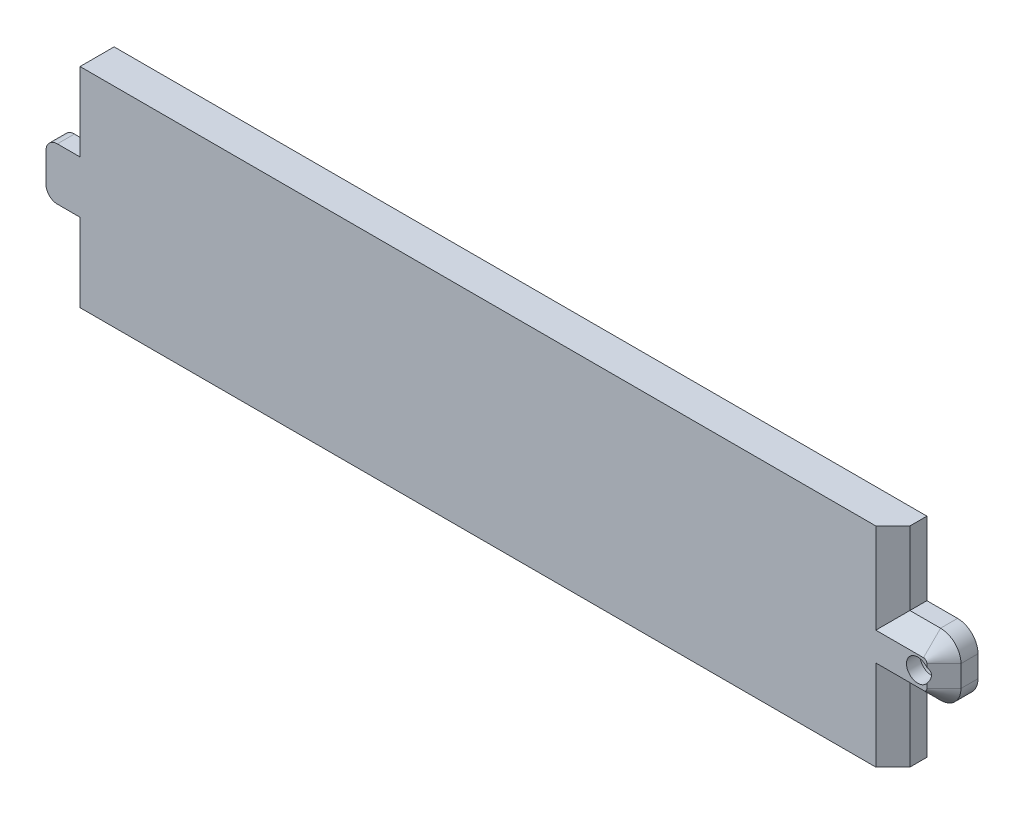
ISO-10303-21;
HEADER;
FILE_DESCRIPTION(('STEP AP214'),'2;1');
FILE_NAME('part.step','',(''),(''),'','','');
FILE_SCHEMA(('AUTOMOTIVE_DESIGN { 1 0 10303 214 1 1 1 1 }'));
ENDSEC;
DATA;
#1=APPLICATION_CONTEXT('core data for automotive mechanical design processes');
#2=APPLICATION_PROTOCOL_DEFINITION('international standard','automotive_design',2000,#1);
#3=PRODUCT_CONTEXT('',#1,'mechanical');
#4=PRODUCT('Part','Part','',(#3));
#5=PRODUCT_RELATED_PRODUCT_CATEGORY('part','',(#4));
#6=PRODUCT_DEFINITION_FORMATION('','',#4);
#7=PRODUCT_DEFINITION_CONTEXT('part definition',#1,'design');
#8=PRODUCT_DEFINITION('design','',#6,#7);
#9=PRODUCT_DEFINITION_SHAPE('','',#8);
#10=(LENGTH_UNIT() NAMED_UNIT(*) SI_UNIT(.MILLI.,.METRE.));
#11=(NAMED_UNIT(*) PLANE_ANGLE_UNIT() SI_UNIT($,.RADIAN.));
#12=(NAMED_UNIT(*) SI_UNIT($,.STERADIAN.) SOLID_ANGLE_UNIT());
#13=UNCERTAINTY_MEASURE_WITH_UNIT(LENGTH_MEASURE(1.E-05),#10,'distance_accuracy_value','');
#14=(GEOMETRIC_REPRESENTATION_CONTEXT(3) GLOBAL_UNCERTAINTY_ASSIGNED_CONTEXT((#13)) GLOBAL_UNIT_ASSIGNED_CONTEXT((#10,
#11,#12)) REPRESENTATION_CONTEXT('',''));
#15=CARTESIAN_POINT('',(0.,0.,0.));
#16=DIRECTION('',(0.,0.,1.));
#17=DIRECTION('',(1.,0.,0.));
#18=AXIS2_PLACEMENT_3D('',#15,#16,#17);
#19=CARTESIAN_POINT('',(-35.8,9.2,3.));
#20=DIRECTION('',(1.,0.,0.));
#21=DIRECTION('',(0.,0.,-1.));
#22=AXIS2_PLACEMENT_3D('',#19,#20,#21);
#23=PLANE('',#22);
#24=DIRECTION('',(0.,0.,-1.));
#25=VECTOR('',#24,1.);
#26=CARTESIAN_POINT('',(-35.8,2.3,3.));
#27=LINE('',#26,#25);
#28=CARTESIAN_POINT('',(-35.8,2.3,3.));
#29=VERTEX_POINT('',#28);
#30=CARTESIAN_POINT('',(-35.8,2.3,1.5));
#31=VERTEX_POINT('',#30);
#32=EDGE_CURVE('E210',#29,#31,#27,.T.);
#33=ORIENTED_EDGE('',*,*,#32,.F.);
#34=DIRECTION('',(0.,-1.,0.));
#35=VECTOR('',#34,1.);
#36=CARTESIAN_POINT('',(-35.8,9.2,3.));
#37=LINE('',#36,#35);
#38=CARTESIAN_POINT('',(-35.8,9.2,3.));
#39=VERTEX_POINT('',#38);
#40=EDGE_CURVE('E197',#39,#29,#37,.T.);
#41=ORIENTED_EDGE('',*,*,#40,.F.);
#42=DIRECTION('',(0.,0.,-1.));
#43=VECTOR('',#42,1.);
#44=CARTESIAN_POINT('',(-35.8,9.2,3.));
#45=LINE('',#44,#43);
#46=CARTESIAN_POINT('',(-35.8,9.2,0.));
#47=VERTEX_POINT('',#46);
#48=EDGE_CURVE('E306',#39,#47,#45,.T.);
#49=ORIENTED_EDGE('',*,*,#48,.T.);
#50=DIRECTION('',(0.,-1.,0.));
#51=VECTOR('',#50,1.);
#52=CARTESIAN_POINT('',(-35.8,9.2,0.));
#53=LINE('',#52,#51);
#54=CARTESIAN_POINT('',(-35.8,-9.2,0.));
#55=VERTEX_POINT('',#54);
#56=EDGE_CURVE('E298',#47,#55,#53,.T.);
#57=ORIENTED_EDGE('',*,*,#56,.T.);
#58=DIRECTION('',(0.,0.,-1.));
#59=VECTOR('',#58,1.);
#60=CARTESIAN_POINT('',(-35.8,-9.2,3.));
#61=LINE('',#60,#59);
#62=CARTESIAN_POINT('',(-35.8,-9.2,3.));
#63=VERTEX_POINT('',#62);
#64=EDGE_CURVE('E303',#63,#55,#61,.T.);
#65=ORIENTED_EDGE('',*,*,#64,.F.);
#66=CARTESIAN_POINT('',(-35.8,-2.3,3.));
#67=VERTEX_POINT('',#66);
#68=EDGE_CURVE('E287',#67,#63,#37,.T.);
#69=ORIENTED_EDGE('',*,*,#68,.F.);
#70=DIRECTION('',(0.,0.,-1.));
#71=VECTOR('',#70,1.);
#72=CARTESIAN_POINT('',(-35.8,-2.3,3.));
#73=LINE('',#72,#71);
#74=CARTESIAN_POINT('',(-35.8,-2.3,1.5));
#75=VERTEX_POINT('',#74);
#76=EDGE_CURVE('E245',#67,#75,#73,.T.);
#77=ORIENTED_EDGE('',*,*,#76,.T.);
#78=DIRECTION('',(0.,1.,0.));
#79=VECTOR('',#78,1.);
#80=CARTESIAN_POINT('',(-35.8,0.,1.5));
#81=LINE('',#80,#79);
#82=EDGE_CURVE('E231',#75,#31,#81,.T.);
#83=ORIENTED_EDGE('',*,*,#82,.T.);
#84=EDGE_LOOP('',(#33,#41,#49,#57,#65,#69,#77,#83));
#85=FACE_BOUND('',#84,.T.);
#86=ADVANCED_FACE('F43',(#85),#23,.F.);
#87=CARTESIAN_POINT('',(38.,0.0499999999999876,3.));
#88=DIRECTION('',(0.,0.,-1.));
#89=DIRECTION('',(-1.,0.,0.));
#90=AXIS2_PLACEMENT_3D('',#87,#88,#89);
#91=CYLINDRICAL_SURFACE('',#90,0.999999999999998);
#92=CARTESIAN_POINT('',(38.,0.0499999999999876,3.));
#93=DIRECTION('',(0.,0.,-1.));
#94=DIRECTION('',(-1.,0.,0.));
#95=AXIS2_PLACEMENT_3D('',#92,#93,#94);
#96=CIRCLE('',#95,0.999999999999998);
#97=CARTESIAN_POINT('',(38.8,-0.550000000000053,3.));
#98=VERTEX_POINT('',#97);
#99=CARTESIAN_POINT('',(38.8,0.650000000000028,3.));
#100=VERTEX_POINT('',#99);
#101=EDGE_CURVE('E255',#98,#100,#96,.T.);
#102=ORIENTED_EDGE('',*,*,#101,.F.);
#103=CARTESIAN_POINT('',(38.,0.0499999999999876,3.79999999999996));
#104=DIRECTION('',(-0.707106781186545,0.,-0.70710678118655));
#105=DIRECTION('',(0.70710678118655,0.,-0.707106781186545));
#106=AXIS2_PLACEMENT_3D('',#103,#104,#105);
#107=ELLIPSE('',#106,1.41421356237309,0.999999999999998);
#108=EDGE_CURVE('E336',#98,#100,#107,.F.);
#109=ORIENTED_EDGE('',*,*,#108,.T.);
#110=EDGE_LOOP('',(#102,#109));
#111=FACE_BOUND('',#110,.T.);
#112=CARTESIAN_POINT('',(38.,0.0499999999999876,1.8));
#113=DIRECTION('',(0.,0.,-1.));
#114=DIRECTION('',(-1.,0.,0.));
#115=AXIS2_PLACEMENT_3D('',#112,#113,#114);
#116=CIRCLE('',#115,0.999999999999998);
#117=CARTESIAN_POINT('',(37.,0.0499999999999876,1.8));
#118=VERTEX_POINT('',#117);
#119=EDGE_CURVE('E252',#118,#118,#116,.F.);
#120=ORIENTED_EDGE('',*,*,#119,.F.);
#121=EDGE_LOOP('',(#120));
#122=FACE_BOUND('',#121,.T.);
#123=ADVANCED_FACE('F412',(#111,#122),#91,.F.);
#124=CARTESIAN_POINT('',(35.8,9.2,3.));
#125=DIRECTION('',(-1.,0.,0.));
#126=DIRECTION('',(0.,0.,1.));
#127=AXIS2_PLACEMENT_3D('',#124,#125,#126);
#128=PLANE('',#127);
#129=DIRECTION('',(0.,0.,1.));
#130=VECTOR('',#129,1.);
#131=CARTESIAN_POINT('',(35.8,-2.75,3.));
#132=LINE('',#131,#130);
#133=CARTESIAN_POINT('',(35.8,-2.75,0.));
#134=VERTEX_POINT('',#133);
#135=CARTESIAN_POINT('',(35.8,-2.75,1.49999999999998));
#136=VERTEX_POINT('',#135);
#137=EDGE_CURVE('E282',#134,#136,#132,.T.);
#138=ORIENTED_EDGE('',*,*,#137,.T.);
#139=DIRECTION('',(0.,-1.,0.));
#140=VECTOR('',#139,1.);
#141=CARTESIAN_POINT('',(35.8,-9.2,1.49999999999998));
#142=LINE('',#141,#140);
#143=CARTESIAN_POINT('',(35.8,-9.2,1.49999999999998));
#144=VERTEX_POINT('',#143);
#145=EDGE_CURVE('E53',#136,#144,#142,.T.);
#146=ORIENTED_EDGE('',*,*,#145,.T.);
#147=DIRECTION('',(0.,0.,-1.));
#148=VECTOR('',#147,1.);
#149=CARTESIAN_POINT('',(35.8,-9.2,3.));
#150=LINE('',#149,#148);
#151=CARTESIAN_POINT('',(35.8,-9.2,0.));
#152=VERTEX_POINT('',#151);
#153=EDGE_CURVE('E293',#144,#152,#150,.T.);
#154=ORIENTED_EDGE('',*,*,#153,.T.);
#155=DIRECTION('',(0.,1.,0.));
#156=VECTOR('',#155,1.);
#157=CARTESIAN_POINT('',(35.8,9.2,0.));
#158=LINE('',#157,#156);
#159=EDGE_CURVE('E294',#152,#134,#158,.T.);
#160=ORIENTED_EDGE('',*,*,#159,.T.);
#161=EDGE_LOOP('',(#138,#146,#154,#160));
#162=FACE_BOUND('',#161,.T.);
#163=ADVANCED_FACE('F388',(#162),#128,.F.);
#164=DIRECTION('',(0.,0.,-1.));
#165=VECTOR('',#164,1.);
#166=CARTESIAN_POINT('',(35.8,9.2,3.));
#167=LINE('',#166,#165);
#168=CARTESIAN_POINT('',(35.8,9.2,1.49999999999998));
#169=VERTEX_POINT('',#168);
#170=CARTESIAN_POINT('',(35.8,9.2,0.));
#171=VERTEX_POINT('',#170);
#172=EDGE_CURVE('E309',#169,#171,#167,.T.);
#173=ORIENTED_EDGE('',*,*,#172,.F.);
#174=DIRECTION('',(0.,-1.,0.));
#175=VECTOR('',#174,1.);
#176=CARTESIAN_POINT('',(35.8,2.75,1.49999999999998));
#177=LINE('',#176,#175);
#178=CARTESIAN_POINT('',(35.8,2.75,1.49999999999998));
#179=VERTEX_POINT('',#178);
#180=EDGE_CURVE('E343',#169,#179,#177,.T.);
#181=ORIENTED_EDGE('',*,*,#180,.T.);
#182=DIRECTION('',(0.,0.,-1.));
#183=VECTOR('',#182,1.);
#184=CARTESIAN_POINT('',(35.8,2.75,3.));
#185=LINE('',#184,#183);
#186=CARTESIAN_POINT('',(35.8,2.75,0.));
#187=VERTEX_POINT('',#186);
#188=EDGE_CURVE('E275',#179,#187,#185,.T.);
#189=ORIENTED_EDGE('',*,*,#188,.T.);
#190=EDGE_CURVE('E284',#187,#171,#158,.T.);
#191=ORIENTED_EDGE('',*,*,#190,.T.);
#192=EDGE_LOOP('',(#173,#181,#189,#191));
#193=FACE_BOUND('',#192,.T.);
#194=ADVANCED_FACE('F445',(#193),#128,.F.);
#195=CARTESIAN_POINT('',(-35.8,9.2,3.));
#196=DIRECTION('',(0.,-1.,0.));
#197=DIRECTION('',(0.,0.,-1.));
#198=AXIS2_PLACEMENT_3D('',#195,#196,#197);
#199=PLANE('',#198);
#200=DIRECTION('',(-1.,0.,0.));
#201=VECTOR('',#200,1.);
#202=CARTESIAN_POINT('',(-35.8,9.2,3.));
#203=LINE('',#202,#201);
#204=CARTESIAN_POINT('',(34.3,9.2,3.));
#205=VERTEX_POINT('',#204);
#206=EDGE_CURVE('E285',#205,#39,#203,.T.);
#207=ORIENTED_EDGE('',*,*,#206,.F.);
#208=DIRECTION('',(0.707106781186544,0.,-0.707106781186551));
#209=VECTOR('',#208,1.);
#210=CARTESIAN_POINT('',(34.3,9.2,3.));
#211=LINE('',#210,#209);
#212=EDGE_CURVE('E68',#205,#169,#211,.T.);
#213=ORIENTED_EDGE('',*,*,#212,.T.);
#214=ORIENTED_EDGE('',*,*,#172,.T.);
#215=DIRECTION('',(-1.,0.,0.));
#216=VECTOR('',#215,1.);
#217=CARTESIAN_POINT('',(-35.8,9.2,0.));
#218=LINE('',#217,#216);
#219=EDGE_CURVE('E296',#171,#47,#218,.T.);
#220=ORIENTED_EDGE('',*,*,#219,.T.);
#221=ORIENTED_EDGE('',*,*,#48,.F.);
#222=EDGE_LOOP('',(#207,#213,#214,#220,#221));
#223=FACE_BOUND('',#222,.T.);
#224=ADVANCED_FACE('F442',(#223),#199,.F.);
#225=CARTESIAN_POINT('',(-35.8,-9.2,3.));
#226=DIRECTION('',(0.,1.,0.));
#227=DIRECTION('',(0.,0.,1.));
#228=AXIS2_PLACEMENT_3D('',#225,#226,#227);
#229=PLANE('',#228);
#230=ORIENTED_EDGE('',*,*,#153,.F.);
#231=DIRECTION('',(-0.707106781186544,0.,0.707106781186551));
#232=VECTOR('',#231,1.);
#233=CARTESIAN_POINT('',(34.3,-9.2,3.));
#234=LINE('',#233,#232);
#235=CARTESIAN_POINT('',(34.3,-9.2,3.));
#236=VERTEX_POINT('',#235);
#237=EDGE_CURVE('E11',#144,#236,#234,.T.);
#238=ORIENTED_EDGE('',*,*,#237,.T.);
#239=DIRECTION('',(1.,0.,0.));
#240=VECTOR('',#239,1.);
#241=CARTESIAN_POINT('',(-35.8,-9.2,3.));
#242=LINE('',#241,#240);
#243=EDGE_CURVE('E290',#63,#236,#242,.T.);
#244=ORIENTED_EDGE('',*,*,#243,.F.);
#245=ORIENTED_EDGE('',*,*,#64,.T.);
#246=DIRECTION('',(1.,0.,0.));
#247=VECTOR('',#246,1.);
#248=CARTESIAN_POINT('',(-35.8,-9.2,0.));
#249=LINE('',#248,#247);
#250=EDGE_CURVE('E288',#55,#152,#249,.T.);
#251=ORIENTED_EDGE('',*,*,#250,.T.);
#252=EDGE_LOOP('',(#230,#238,#244,#245,#251));
#253=FACE_BOUND('',#252,.T.);
#254=ADVANCED_FACE('F373',(#253),#229,.F.);
#255=CARTESIAN_POINT('',(0.,0.,3.));
#256=DIRECTION('',(0.,0.,1.));
#257=DIRECTION('',(1.,0.,0.));
#258=AXIS2_PLACEMENT_3D('',#255,#256,#257);
#259=PLANE('',#258);
#260=ORIENTED_EDGE('',*,*,#101,.T.);
#261=DIRECTION('',(0.,1.,0.));
#262=VECTOR('',#261,1.);
#263=CARTESIAN_POINT('',(38.8,0.,3.));
#264=LINE('',#263,#262);
#265=CARTESIAN_POINT('',(38.8,0.949999999999998,3.));
#266=VERTEX_POINT('',#265);
#267=EDGE_CURVE('E330',#100,#266,#264,.T.);
#268=ORIENTED_EDGE('',*,*,#267,.T.);
#269=CARTESIAN_POINT('',(38.5,0.95,3.));
#270=DIRECTION('',(0.,0.,1.));
#271=DIRECTION('',(1.,0.,0.));
#272=AXIS2_PLACEMENT_3D('',#269,#270,#271);
#273=CIRCLE('',#272,0.299999999999985);
#274=CARTESIAN_POINT('',(38.5,1.24999999999998,3.));
#275=VERTEX_POINT('',#274);
#276=EDGE_CURVE('E328',#266,#275,#273,.T.);
#277=ORIENTED_EDGE('',*,*,#276,.T.);
#278=DIRECTION('',(-1.,0.,0.));
#279=VECTOR('',#278,1.);
#280=CARTESIAN_POINT('',(0.,1.24999999999999,3.));
#281=LINE('',#280,#279);
#282=CARTESIAN_POINT('',(34.3,1.24999999999998,3.));
#283=VERTEX_POINT('',#282);
#284=EDGE_CURVE('E326',#275,#283,#281,.T.);
#285=ORIENTED_EDGE('',*,*,#284,.T.);
#286=DIRECTION('',(0.,1.,0.));
#287=VECTOR('',#286,1.);
#288=CARTESIAN_POINT('',(34.3,9.2,3.));
#289=LINE('',#288,#287);
#290=EDGE_CURVE('E324',#283,#205,#289,.T.);
#291=ORIENTED_EDGE('',*,*,#290,.T.);
#292=ORIENTED_EDGE('',*,*,#206,.T.);
#293=ORIENTED_EDGE('',*,*,#40,.T.);
#294=DIRECTION('',(-1.,0.,0.));
#295=VECTOR('',#294,1.);
#296=CARTESIAN_POINT('',(0.,2.3,3.));
#297=LINE('',#296,#295);
#298=CARTESIAN_POINT('',(-37.8,2.3,3.));
#299=VERTEX_POINT('',#298);
#300=EDGE_CURVE('E189',#29,#299,#297,.T.);
#301=ORIENTED_EDGE('',*,*,#300,.T.);
#302=CARTESIAN_POINT('',(-37.8,1.3,3.));
#303=DIRECTION('',(0.,0.,-1.));
#304=DIRECTION('',(-1.,0.,0.));
#305=AXIS2_PLACEMENT_3D('',#302,#303,#304);
#306=CIRCLE('',#305,1.);
#307=CARTESIAN_POINT('',(-38.8,1.29999999999999,3.));
#308=VERTEX_POINT('',#307);
#309=EDGE_CURVE('E194',#299,#308,#306,.F.);
#310=ORIENTED_EDGE('',*,*,#309,.T.);
#311=DIRECTION('',(0.,-1.,0.));
#312=VECTOR('',#311,1.);
#313=CARTESIAN_POINT('',(-38.8,0.,3.));
#314=LINE('',#313,#312);
#315=CARTESIAN_POINT('',(-38.8,-1.29999999999999,3.));
#316=VERTEX_POINT('',#315);
#317=EDGE_CURVE('E211',#308,#316,#314,.T.);
#318=ORIENTED_EDGE('',*,*,#317,.T.);
#319=CARTESIAN_POINT('',(-37.8,-1.3,3.));
#320=DIRECTION('',(0.,0.,-1.));
#321=DIRECTION('',(-1.,0.,0.));
#322=AXIS2_PLACEMENT_3D('',#319,#320,#321);
#323=CIRCLE('',#322,1.);
#324=CARTESIAN_POINT('',(-37.8,-2.3,3.));
#325=VERTEX_POINT('',#324);
#326=EDGE_CURVE('E224',#325,#316,#323,.T.);
#327=ORIENTED_EDGE('',*,*,#326,.F.);
#328=DIRECTION('',(-1.,0.,0.));
#329=VECTOR('',#328,1.);
#330=CARTESIAN_POINT('',(0.,-2.3,3.));
#331=LINE('',#330,#329);
#332=EDGE_CURVE('E200',#67,#325,#331,.T.);
#333=ORIENTED_EDGE('',*,*,#332,.F.);
#334=ORIENTED_EDGE('',*,*,#68,.T.);
#335=ORIENTED_EDGE('',*,*,#243,.T.);
#336=DIRECTION('',(0.,1.,0.));
#337=VECTOR('',#336,1.);
#338=CARTESIAN_POINT('',(34.3,-2.75,3.));
#339=LINE('',#338,#337);
#340=CARTESIAN_POINT('',(34.3,-1.24999999999998,3.));
#341=VERTEX_POINT('',#340);
#342=EDGE_CURVE('E316',#236,#341,#339,.T.);
#343=ORIENTED_EDGE('',*,*,#342,.T.);
#344=DIRECTION('',(1.,0.,0.));
#345=VECTOR('',#344,1.);
#346=CARTESIAN_POINT('',(0.,-1.24999999999998,3.));
#347=LINE('',#346,#345);
#348=CARTESIAN_POINT('',(38.5,-1.24999999999998,3.));
#349=VERTEX_POINT('',#348);
#350=EDGE_CURVE('E318',#341,#349,#347,.T.);
#351=ORIENTED_EDGE('',*,*,#350,.T.);
#352=CARTESIAN_POINT('',(38.5,-0.950000000000001,3.));
#353=DIRECTION('',(0.,0.,1.));
#354=DIRECTION('',(1.,0.,0.));
#355=AXIS2_PLACEMENT_3D('',#352,#353,#354);
#356=CIRCLE('',#355,0.299999999999981);
#357=CARTESIAN_POINT('',(38.8,-0.949999999999988,3.));
#358=VERTEX_POINT('',#357);
#359=EDGE_CURVE('E320',#349,#358,#356,.T.);
#360=ORIENTED_EDGE('',*,*,#359,.T.);
#361=DIRECTION('',(0.,1.,0.));
#362=VECTOR('',#361,1.);
#363=CARTESIAN_POINT('',(38.8,0.,3.));
#364=LINE('',#363,#362);
#365=EDGE_CURVE('E322',#358,#98,#364,.T.);
#366=ORIENTED_EDGE('',*,*,#365,.T.);
#367=EDGE_LOOP('',(#260,#268,#277,#285,#291,#292,#293,#301,#310,#318,#327,#333,#334,#335,#343,
#351,#360,#366));
#368=FACE_BOUND('',#367,.T.);
#369=ADVANCED_FACE('F192',(#368),#259,.T.);
#370=CARTESIAN_POINT('',(0.,0.,0.));
#371=DIRECTION('',(0.,0.,1.));
#372=DIRECTION('',(1.,0.,0.));
#373=AXIS2_PLACEMENT_3D('',#370,#371,#372);
#374=PLANE('',#373);
#375=CARTESIAN_POINT('',(38.,0.0499999999999876,0.));
#376=DIRECTION('',(0.,0.,-1.));
#377=DIRECTION('',(-1.,0.,0.));
#378=AXIS2_PLACEMENT_3D('',#375,#376,#377);
#379=CIRCLE('',#378,1.85);
#380=CARTESIAN_POINT('',(36.15,0.0499999999999876,0.));
#381=VERTEX_POINT('',#380);
#382=EDGE_CURVE('E240',#381,#381,#379,.T.);
#383=ORIENTED_EDGE('',*,*,#382,.F.);
#384=EDGE_LOOP('',(#383));
#385=FACE_BOUND('',#384,.T.);
#386=ORIENTED_EDGE('',*,*,#190,.F.);
#387=DIRECTION('',(1.,0.,0.));
#388=VECTOR('',#387,1.);
#389=CARTESIAN_POINT('',(31.3,2.75,0.));
#390=LINE('',#389,#388);
#391=CARTESIAN_POINT('',(38.5,2.75,0.));
#392=VERTEX_POINT('',#391);
#393=EDGE_CURVE('E257',#187,#392,#390,.T.);
#394=ORIENTED_EDGE('',*,*,#393,.T.);
#395=CARTESIAN_POINT('',(38.5,0.95,0.));
#396=DIRECTION('',(0.,0.,-1.));
#397=DIRECTION('',(-1.,0.,0.));
#398=AXIS2_PLACEMENT_3D('',#395,#396,#397);
#399=CIRCLE('',#398,1.8);
#400=CARTESIAN_POINT('',(40.3,0.949999999999987,0.));
#401=VERTEX_POINT('',#400);
#402=EDGE_CURVE('E260',#392,#401,#399,.T.);
#403=ORIENTED_EDGE('',*,*,#402,.T.);
#404=DIRECTION('',(0.,-1.,0.));
#405=VECTOR('',#404,1.);
#406=CARTESIAN_POINT('',(40.3,0.949999999999987,0.));
#407=LINE('',#406,#405);
#408=CARTESIAN_POINT('',(40.3,-0.949999999999988,0.));
#409=VERTEX_POINT('',#408);
#410=EDGE_CURVE('E263',#401,#409,#407,.T.);
#411=ORIENTED_EDGE('',*,*,#410,.T.);
#412=CARTESIAN_POINT('',(38.5,-0.950000000000001,0.));
#413=DIRECTION('',(0.,0.,-1.));
#414=DIRECTION('',(1.,0.,0.));
#415=AXIS2_PLACEMENT_3D('',#412,#413,#414);
#416=CIRCLE('',#415,1.8);
#417=CARTESIAN_POINT('',(38.5,-2.75,0.));
#418=VERTEX_POINT('',#417);
#419=EDGE_CURVE('E266',#409,#418,#416,.T.);
#420=ORIENTED_EDGE('',*,*,#419,.T.);
#421=DIRECTION('',(-1.,0.,0.));
#422=VECTOR('',#421,1.);
#423=CARTESIAN_POINT('',(31.3,-2.75,0.));
#424=LINE('',#423,#422);
#425=EDGE_CURVE('E269',#418,#134,#424,.T.);
#426=ORIENTED_EDGE('',*,*,#425,.T.);
#427=ORIENTED_EDGE('',*,*,#159,.F.);
#428=ORIENTED_EDGE('',*,*,#250,.F.);
#429=ORIENTED_EDGE('',*,*,#56,.F.);
#430=ORIENTED_EDGE('',*,*,#219,.F.);
#431=EDGE_LOOP('',(#386,#394,#403,#411,#420,#426,#427,#428,#429,#430));
#432=FACE_BOUND('',#431,.T.);
#433=ADVANCED_FACE('F384',(#385,#432),#374,.F.);
#434=CARTESIAN_POINT('',(31.3,-2.75,3.));
#435=DIRECTION('',(0.,-1.,0.));
#436=DIRECTION('',(1.,0.,0.));
#437=AXIS2_PLACEMENT_3D('',#434,#435,#436);
#438=PLANE('',#437);
#439=DIRECTION('',(0.,0.,-1.));
#440=VECTOR('',#439,1.);
#441=CARTESIAN_POINT('',(38.5,-2.75,3.));
#442=LINE('',#441,#440);
#443=CARTESIAN_POINT('',(38.5,-2.75,1.5));
#444=VERTEX_POINT('',#443);
#445=EDGE_CURVE('E273',#444,#418,#442,.T.);
#446=ORIENTED_EDGE('',*,*,#445,.F.);
#447=DIRECTION('',(-1.,0.,0.));
#448=VECTOR('',#447,1.);
#449=CARTESIAN_POINT('',(31.3,-2.75,1.5));
#450=LINE('',#449,#448);
#451=EDGE_CURVE('E338',#444,#136,#450,.T.);
#452=ORIENTED_EDGE('',*,*,#451,.T.);
#453=ORIENTED_EDGE('',*,*,#137,.F.);
#454=ORIENTED_EDGE('',*,*,#425,.F.);
#455=EDGE_LOOP('',(#446,#452,#453,#454));
#456=FACE_BOUND('',#455,.T.);
#457=ADVANCED_FACE('F391',(#456),#438,.T.);
#458=CARTESIAN_POINT('',(31.3,2.75,3.));
#459=DIRECTION('',(0.,1.,0.));
#460=DIRECTION('',(-1.,0.,0.));
#461=AXIS2_PLACEMENT_3D('',#458,#459,#460);
#462=PLANE('',#461);
#463=ORIENTED_EDGE('',*,*,#188,.F.);
#464=DIRECTION('',(1.,0.,0.));
#465=VECTOR('',#464,1.);
#466=CARTESIAN_POINT('',(31.3,2.75,1.5));
#467=LINE('',#466,#465);
#468=CARTESIAN_POINT('',(38.5,2.75,1.5));
#469=VERTEX_POINT('',#468);
#470=EDGE_CURVE('E311',#179,#469,#467,.T.);
#471=ORIENTED_EDGE('',*,*,#470,.T.);
#472=DIRECTION('',(0.,0.,-1.));
#473=VECTOR('',#472,1.);
#474=CARTESIAN_POINT('',(38.5,2.75,3.));
#475=LINE('',#474,#473);
#476=EDGE_CURVE('E272',#469,#392,#475,.T.);
#477=ORIENTED_EDGE('',*,*,#476,.T.);
#478=ORIENTED_EDGE('',*,*,#393,.F.);
#479=EDGE_LOOP('',(#463,#471,#477,#478));
#480=FACE_BOUND('',#479,.T.);
#481=ADVANCED_FACE('F618',(#480),#462,.T.);
#482=CARTESIAN_POINT('',(38.5,-0.950000000000001,3.));
#483=DIRECTION('',(0.,0.,-1.));
#484=DIRECTION('',(-1.,0.,0.));
#485=AXIS2_PLACEMENT_3D('',#482,#483,#484);
#486=CYLINDRICAL_SURFACE('',#485,1.8);
#487=DIRECTION('',(0.,0.,-1.));
#488=VECTOR('',#487,1.);
#489=CARTESIAN_POINT('',(40.3,-0.949999999999988,3.));
#490=LINE('',#489,#488);
#491=CARTESIAN_POINT('',(40.3,-0.949999999999988,1.5));
#492=VERTEX_POINT('',#491);
#493=EDGE_CURVE('E276',#492,#409,#490,.T.);
#494=ORIENTED_EDGE('',*,*,#493,.F.);
#495=CARTESIAN_POINT('',(38.5,-0.950000000000001,1.5));
#496=DIRECTION('',(0.,0.,1.));
#497=DIRECTION('',(1.,0.,0.));
#498=AXIS2_PLACEMENT_3D('',#495,#496,#497);
#499=CIRCLE('',#498,1.8);
#500=EDGE_CURVE('E340',#492,#444,#499,.F.);
#501=ORIENTED_EDGE('',*,*,#500,.T.);
#502=ORIENTED_EDGE('',*,*,#445,.T.);
#503=ORIENTED_EDGE('',*,*,#419,.F.);
#504=EDGE_LOOP('',(#494,#501,#502,#503));
#505=FACE_BOUND('',#504,.T.);
#506=ADVANCED_FACE('F395',(#505),#486,.T.);
#507=CARTESIAN_POINT('',(40.3,0.949999999999987,3.));
#508=DIRECTION('',(1.,0.,0.));
#509=DIRECTION('',(0.,0.,-1.));
#510=AXIS2_PLACEMENT_3D('',#507,#508,#509);
#511=PLANE('',#510);
#512=DIRECTION('',(0.,0.,-1.));
#513=VECTOR('',#512,1.);
#514=CARTESIAN_POINT('',(40.3,0.949999999999987,3.));
#515=LINE('',#514,#513);
#516=CARTESIAN_POINT('',(40.3,0.949999999999987,1.5));
#517=VERTEX_POINT('',#516);
#518=EDGE_CURVE('E278',#517,#401,#515,.T.);
#519=ORIENTED_EDGE('',*,*,#518,.F.);
#520=DIRECTION('',(0.,-1.,0.));
#521=VECTOR('',#520,1.);
#522=CARTESIAN_POINT('',(40.3,0.949999999999987,1.5));
#523=LINE('',#522,#521);
#524=EDGE_CURVE('E334',#517,#492,#523,.T.);
#525=ORIENTED_EDGE('',*,*,#524,.T.);
#526=ORIENTED_EDGE('',*,*,#493,.T.);
#527=ORIENTED_EDGE('',*,*,#410,.F.);
#528=EDGE_LOOP('',(#519,#525,#526,#527));
#529=FACE_BOUND('',#528,.T.);
#530=ADVANCED_FACE('F400',(#529),#511,.T.);
#531=CARTESIAN_POINT('',(38.5,0.95,3.));
#532=DIRECTION('',(0.,0.,-1.));
#533=DIRECTION('',(-1.,0.,0.));
#534=AXIS2_PLACEMENT_3D('',#531,#532,#533);
#535=CYLINDRICAL_SURFACE('',#534,1.8);
#536=ORIENTED_EDGE('',*,*,#476,.F.);
#537=CARTESIAN_POINT('',(38.5,0.95,1.5));
#538=DIRECTION('',(0.,0.,1.));
#539=DIRECTION('',(1.,0.,0.));
#540=AXIS2_PLACEMENT_3D('',#537,#538,#539);
#541=CIRCLE('',#540,1.8);
#542=EDGE_CURVE('E332',#469,#517,#541,.F.);
#543=ORIENTED_EDGE('',*,*,#542,.T.);
#544=ORIENTED_EDGE('',*,*,#518,.T.);
#545=ORIENTED_EDGE('',*,*,#402,.F.);
#546=EDGE_LOOP('',(#536,#543,#544,#545));
#547=FACE_BOUND('',#546,.T.);
#548=ADVANCED_FACE('F421',(#547),#535,.T.);
#549=CARTESIAN_POINT('',(38.,0.0499999999999876,1.8));
#550=DIRECTION('',(0.,0.,-1.));
#551=DIRECTION('',(-1.,0.,0.));
#552=AXIS2_PLACEMENT_3D('',#549,#550,#551);
#553=PLANE('',#552);
#554=CARTESIAN_POINT('',(38.,0.0499999999999876,1.8));
#555=DIRECTION('',(0.,0.,-1.));
#556=DIRECTION('',(-1.,0.,0.));
#557=AXIS2_PLACEMENT_3D('',#554,#555,#556);
#558=CIRCLE('',#557,1.85);
#559=CARTESIAN_POINT('',(36.15,0.0499999999999876,1.8));
#560=VERTEX_POINT('',#559);
#561=EDGE_CURVE('E249',#560,#560,#558,.T.);
#562=ORIENTED_EDGE('',*,*,#561,.T.);
#563=EDGE_LOOP('',(#562));
#564=FACE_BOUND('',#563,.T.);
#565=ORIENTED_EDGE('',*,*,#119,.T.);
#566=EDGE_LOOP('',(#565));
#567=FACE_BOUND('',#566,.T.);
#568=ADVANCED_FACE('F418',(#564,#567),#553,.T.);
#569=CARTESIAN_POINT('',(38.,0.0499999999999876,1.8));
#570=DIRECTION('',(0.,0.,-1.));
#571=DIRECTION('',(-1.,0.,0.));
#572=AXIS2_PLACEMENT_3D('',#569,#570,#571);
#573=CYLINDRICAL_SURFACE('',#572,1.85);
#574=ORIENTED_EDGE('',*,*,#561,.F.);
#575=EDGE_LOOP('',(#574));
#576=FACE_BOUND('',#575,.T.);
#577=ORIENTED_EDGE('',*,*,#382,.T.);
#578=EDGE_LOOP('',(#577));
#579=FACE_BOUND('',#578,.T.);
#580=ADVANCED_FACE('F420',(#576,#579),#573,.F.);
#581=CARTESIAN_POINT('',(-37.8,1.3,3.));
#582=DIRECTION('',(0.,0.,-1.));
#583=DIRECTION('',(-1.,0.,0.));
#584=AXIS2_PLACEMENT_3D('',#581,#582,#583);
#585=CYLINDRICAL_SURFACE('',#584,1.);
#586=CARTESIAN_POINT('',(-37.8,1.3,1.5));
#587=DIRECTION('',(0.,0.,-1.));
#588=DIRECTION('',(-1.,0.,0.));
#589=AXIS2_PLACEMENT_3D('',#586,#587,#588);
#590=CIRCLE('',#589,1.);
#591=CARTESIAN_POINT('',(-37.8,2.3,1.5));
#592=VERTEX_POINT('',#591);
#593=CARTESIAN_POINT('',(-38.8,1.29999999999999,1.5));
#594=VERTEX_POINT('',#593);
#595=EDGE_CURVE('E228',#592,#594,#590,.F.);
#596=ORIENTED_EDGE('',*,*,#595,.T.);
#597=DIRECTION('',(0.,0.,-1.));
#598=VECTOR('',#597,1.);
#599=CARTESIAN_POINT('',(-38.8,1.29999999999999,3.));
#600=LINE('',#599,#598);
#601=EDGE_CURVE('E215',#308,#594,#600,.T.);
#602=ORIENTED_EDGE('',*,*,#601,.F.);
#603=ORIENTED_EDGE('',*,*,#309,.F.);
#604=DIRECTION('',(0.,0.,-1.));
#605=VECTOR('',#604,1.);
#606=CARTESIAN_POINT('',(-37.8,2.3,3.));
#607=LINE('',#606,#605);
#608=EDGE_CURVE('E203',#299,#592,#607,.T.);
#609=ORIENTED_EDGE('',*,*,#608,.T.);
#610=EDGE_LOOP('',(#596,#602,#603,#609));
#611=FACE_BOUND('',#610,.T.);
#612=ADVANCED_FACE('F213',(#611),#585,.T.);
#613=CARTESIAN_POINT('',(-38.8,0.,3.));
#614=DIRECTION('',(1.,0.,0.));
#615=DIRECTION('',(0.,0.,-1.));
#616=AXIS2_PLACEMENT_3D('',#613,#614,#615);
#617=PLANE('',#616);
#618=DIRECTION('',(0.,-1.,0.));
#619=VECTOR('',#618,1.);
#620=CARTESIAN_POINT('',(-38.8,0.,1.5));
#621=LINE('',#620,#619);
#622=CARTESIAN_POINT('',(-38.8,-1.29999999999999,1.5));
#623=VERTEX_POINT('',#622);
#624=EDGE_CURVE('E216',#594,#623,#621,.T.);
#625=ORIENTED_EDGE('',*,*,#624,.T.);
#626=DIRECTION('',(0.,0.,-1.));
#627=VECTOR('',#626,1.);
#628=CARTESIAN_POINT('',(-38.8,-1.29999999999999,3.));
#629=LINE('',#628,#627);
#630=EDGE_CURVE('E241',#316,#623,#629,.T.);
#631=ORIENTED_EDGE('',*,*,#630,.F.);
#632=ORIENTED_EDGE('',*,*,#317,.F.);
#633=ORIENTED_EDGE('',*,*,#601,.T.);
#634=EDGE_LOOP('',(#625,#631,#632,#633));
#635=FACE_BOUND('',#634,.T.);
#636=ADVANCED_FACE('F498',(#635),#617,.F.);
#637=CARTESIAN_POINT('',(-37.8,-1.3,3.));
#638=DIRECTION('',(0.,0.,-1.));
#639=DIRECTION('',(-1.,0.,0.));
#640=AXIS2_PLACEMENT_3D('',#637,#638,#639);
#641=CYLINDRICAL_SURFACE('',#640,1.);
#642=CARTESIAN_POINT('',(-37.8,-1.3,1.5));
#643=DIRECTION('',(0.,0.,-1.));
#644=DIRECTION('',(-1.,0.,0.));
#645=AXIS2_PLACEMENT_3D('',#642,#643,#644);
#646=CIRCLE('',#645,1.);
#647=CARTESIAN_POINT('',(-37.8,-2.3,1.5));
#648=VERTEX_POINT('',#647);
#649=EDGE_CURVE('E219',#648,#623,#646,.T.);
#650=ORIENTED_EDGE('',*,*,#649,.F.);
#651=DIRECTION('',(0.,0.,-1.));
#652=VECTOR('',#651,1.);
#653=CARTESIAN_POINT('',(-37.8,-2.3,3.));
#654=LINE('',#653,#652);
#655=EDGE_CURVE('E243',#325,#648,#654,.T.);
#656=ORIENTED_EDGE('',*,*,#655,.F.);
#657=ORIENTED_EDGE('',*,*,#326,.T.);
#658=ORIENTED_EDGE('',*,*,#630,.T.);
#659=EDGE_LOOP('',(#650,#656,#657,#658));
#660=FACE_BOUND('',#659,.T.);
#661=ADVANCED_FACE('F501',(#660),#641,.T.);
#662=CARTESIAN_POINT('',(0.,-2.3,3.));
#663=DIRECTION('',(0.,-1.,0.));
#664=DIRECTION('',(0.,0.,-1.));
#665=AXIS2_PLACEMENT_3D('',#662,#663,#664);
#666=PLANE('',#665);
#667=DIRECTION('',(-1.,0.,0.));
#668=VECTOR('',#667,1.);
#669=CARTESIAN_POINT('',(0.,-2.3,1.5));
#670=LINE('',#669,#668);
#671=EDGE_CURVE('E234',#75,#648,#670,.T.);
#672=ORIENTED_EDGE('',*,*,#671,.F.);
#673=ORIENTED_EDGE('',*,*,#76,.F.);
#674=ORIENTED_EDGE('',*,*,#332,.T.);
#675=ORIENTED_EDGE('',*,*,#655,.T.);
#676=EDGE_LOOP('',(#672,#673,#674,#675));
#677=FACE_BOUND('',#676,.T.);
#678=ADVANCED_FACE('F495',(#677),#666,.T.);
#679=CARTESIAN_POINT('',(0.,2.3,3.));
#680=DIRECTION('',(0.,-1.,0.));
#681=DIRECTION('',(0.,0.,-1.));
#682=AXIS2_PLACEMENT_3D('',#679,#680,#681);
#683=PLANE('',#682);
#684=DIRECTION('',(-1.,0.,0.));
#685=VECTOR('',#684,1.);
#686=CARTESIAN_POINT('',(0.,2.3,1.5));
#687=LINE('',#686,#685);
#688=EDGE_CURVE('E206',#31,#592,#687,.T.);
#689=ORIENTED_EDGE('',*,*,#688,.T.);
#690=ORIENTED_EDGE('',*,*,#608,.F.);
#691=ORIENTED_EDGE('',*,*,#300,.F.);
#692=ORIENTED_EDGE('',*,*,#32,.T.);
#693=EDGE_LOOP('',(#689,#690,#691,#692));
#694=FACE_BOUND('',#693,.T.);
#695=ADVANCED_FACE('F204',(#694),#683,.F.);
#696=CARTESIAN_POINT('',(0.,0.,1.5));
#697=DIRECTION('',(0.,0.,-1.));
#698=DIRECTION('',(-1.,0.,0.));
#699=AXIS2_PLACEMENT_3D('',#696,#697,#698);
#700=PLANE('',#699);
#701=ORIENTED_EDGE('',*,*,#595,.F.);
#702=ORIENTED_EDGE('',*,*,#688,.F.);
#703=ORIENTED_EDGE('',*,*,#82,.F.);
#704=ORIENTED_EDGE('',*,*,#671,.T.);
#705=ORIENTED_EDGE('',*,*,#649,.T.);
#706=ORIENTED_EDGE('',*,*,#624,.F.);
#707=EDGE_LOOP('',(#701,#702,#703,#704,#705,#706));
#708=FACE_BOUND('',#707,.T.);
#709=ADVANCED_FACE('F486',(#708),#700,.T.);
#710=CARTESIAN_POINT('',(34.3,0.,3.));
#711=DIRECTION('',(0.707106781186551,0.,0.707106781186544));
#712=DIRECTION('',(0.,-1.,0.));
#713=AXIS2_PLACEMENT_3D('',#710,#711,#712);
#714=PLANE('',#713);
#715=ORIENTED_EDGE('',*,*,#237,.F.);
#716=ORIENTED_EDGE('',*,*,#145,.F.);
#717=DIRECTION('',(0.577350269189621,-0.577350269189631,-0.577350269189626));
#718=VECTOR('',#717,1.);
#719=CARTESIAN_POINT('',(34.3,-1.25,2.99999999999999));
#720=LINE('',#719,#718);
#721=EDGE_CURVE('E48',#341,#136,#720,.T.);
#722=ORIENTED_EDGE('',*,*,#721,.F.);
#723=ORIENTED_EDGE('',*,*,#342,.F.);
#724=EDGE_LOOP('',(#715,#716,#722,#723));
#725=FACE_BOUND('',#724,.T.);
#726=ADVANCED_FACE('F46',(#725),#714,.T.);
#727=CARTESIAN_POINT('',(31.3,-2.75,1.5));
#728=DIRECTION('',(0.,0.707106781186544,-0.70710678118655));
#729=DIRECTION('',(-1.,0.,0.));
#730=AXIS2_PLACEMENT_3D('',#727,#728,#729);
#731=PLANE('',#730);
#732=ORIENTED_EDGE('',*,*,#721,.T.);
#733=ORIENTED_EDGE('',*,*,#451,.F.);
#734=DIRECTION('',(0.,-0.707106781186551,-0.707106781186545));
#735=VECTOR('',#734,1.);
#736=CARTESIAN_POINT('',(38.5,-1.24999999999998,3.));
#737=LINE('',#736,#735);
#738=EDGE_CURVE('E356',#349,#444,#737,.T.);
#739=ORIENTED_EDGE('',*,*,#738,.F.);
#740=ORIENTED_EDGE('',*,*,#350,.F.);
#741=EDGE_LOOP('',(#732,#733,#739,#740));
#742=FACE_BOUND('',#741,.T.);
#743=ADVANCED_FACE('F367',(#742),#731,.F.);
#744=CARTESIAN_POINT('',(38.5,-0.950000000000001,1.5));
#745=DIRECTION('',(0.,0.,-1.));
#746=DIRECTION('',(-1.,0.,0.));
#747=AXIS2_PLACEMENT_3D('',#744,#745,#746);
#748=CONICAL_SURFACE('',#747,1.8,0.785398163397453);
#749=ORIENTED_EDGE('',*,*,#738,.T.);
#750=ORIENTED_EDGE('',*,*,#500,.F.);
#751=DIRECTION('',(0.70710678118655,0.,-0.707106781186545));
#752=VECTOR('',#751,1.);
#753=CARTESIAN_POINT('',(38.8,-0.949999999999988,3.));
#754=LINE('',#753,#752);
#755=EDGE_CURVE('E354',#358,#492,#754,.T.);
#756=ORIENTED_EDGE('',*,*,#755,.F.);
#757=ORIENTED_EDGE('',*,*,#359,.F.);
#758=EDGE_LOOP('',(#749,#750,#756,#757));
#759=FACE_BOUND('',#758,.T.);
#760=ADVANCED_FACE('F403',(#759),#748,.T.);
#761=CARTESIAN_POINT('',(40.3,0.949999999999987,1.5));
#762=DIRECTION('',(-0.707106781186545,0.,-0.70710678118655));
#763=DIRECTION('',(0.,-1.,0.));
#764=AXIS2_PLACEMENT_3D('',#761,#762,#763);
#765=PLANE('',#764);
#766=ORIENTED_EDGE('',*,*,#755,.T.);
#767=ORIENTED_EDGE('',*,*,#524,.F.);
#768=DIRECTION('',(0.70710678118655,0.,-0.707106781186545));
#769=VECTOR('',#768,1.);
#770=CARTESIAN_POINT('',(38.8,0.949999999999998,3.));
#771=LINE('',#770,#769);
#772=EDGE_CURVE('E351',#266,#517,#771,.T.);
#773=ORIENTED_EDGE('',*,*,#772,.F.);
#774=ORIENTED_EDGE('',*,*,#267,.F.);
#775=ORIENTED_EDGE('',*,*,#108,.F.);
#776=ORIENTED_EDGE('',*,*,#365,.F.);
#777=EDGE_LOOP('',(#766,#767,#773,#774,#775,#776));
#778=FACE_BOUND('',#777,.T.);
#779=ADVANCED_FACE('F406',(#778),#765,.F.);
#780=CARTESIAN_POINT('',(34.3,0.,3.));
#781=DIRECTION('',(0.707106781186551,0.,0.707106781186544));
#782=DIRECTION('',(0.,-1.,0.));
#783=AXIS2_PLACEMENT_3D('',#780,#781,#782);
#784=PLANE('',#783);
#785=ORIENTED_EDGE('',*,*,#212,.F.);
#786=ORIENTED_EDGE('',*,*,#290,.F.);
#787=DIRECTION('',(-0.577350269189621,-0.577350269189631,0.577350269189626));
#788=VECTOR('',#787,1.);
#789=CARTESIAN_POINT('',(34.3,1.25,2.99999999999999));
#790=LINE('',#789,#788);
#791=EDGE_CURVE('E348',#179,#283,#790,.T.);
#792=ORIENTED_EDGE('',*,*,#791,.F.);
#793=ORIENTED_EDGE('',*,*,#180,.F.);
#794=EDGE_LOOP('',(#785,#786,#792,#793));
#795=FACE_BOUND('',#794,.T.);
#796=ADVANCED_FACE('F463',(#795),#784,.T.);
#797=CARTESIAN_POINT('',(38.5,0.95,1.5));
#798=DIRECTION('',(0.,0.,-1.));
#799=DIRECTION('',(-1.,0.,0.));
#800=AXIS2_PLACEMENT_3D('',#797,#798,#799);
#801=CONICAL_SURFACE('',#800,1.8,0.785398163397452);
#802=ORIENTED_EDGE('',*,*,#772,.T.);
#803=ORIENTED_EDGE('',*,*,#542,.F.);
#804=DIRECTION('',(0.,0.70710678118655,-0.707106781186544));
#805=VECTOR('',#804,1.);
#806=CARTESIAN_POINT('',(38.5,1.24999999999999,3.));
#807=LINE('',#806,#805);
#808=EDGE_CURVE('E346',#275,#469,#807,.T.);
#809=ORIENTED_EDGE('',*,*,#808,.F.);
#810=ORIENTED_EDGE('',*,*,#276,.F.);
#811=EDGE_LOOP('',(#802,#803,#809,#810));
#812=FACE_BOUND('',#811,.T.);
#813=ADVANCED_FACE('F456',(#812),#801,.T.);
#814=CARTESIAN_POINT('',(31.3,2.75,1.5));
#815=DIRECTION('',(0.,-0.707106781186544,-0.70710678118655));
#816=DIRECTION('',(1.,0.,0.));
#817=AXIS2_PLACEMENT_3D('',#814,#815,#816);
#818=PLANE('',#817);
#819=ORIENTED_EDGE('',*,*,#791,.T.);
#820=ORIENTED_EDGE('',*,*,#284,.F.);
#821=ORIENTED_EDGE('',*,*,#808,.T.);
#822=ORIENTED_EDGE('',*,*,#470,.F.);
#823=EDGE_LOOP('',(#819,#820,#821,#822));
#824=FACE_BOUND('',#823,.T.);
#825=ADVANCED_FACE('F450',(#824),#818,.F.);
#826=CLOSED_SHELL('',(#86,#123,#163,#194,#224,#254,#369,#433,#457,#481,#506,#530,#548,#568,#580,
#612,#636,#661,#678,#695,#709,#726,#743,#760,#779,#796,#813,#825));
#827=MANIFOLD_SOLID_BREP('B2',#826);
#828=ADVANCED_BREP_SHAPE_REPRESENTATION('',(#18,#827),#14);
#829=SHAPE_DEFINITION_REPRESENTATION(#9,#828);
ENDSEC;
END-ISO-10303-21;
